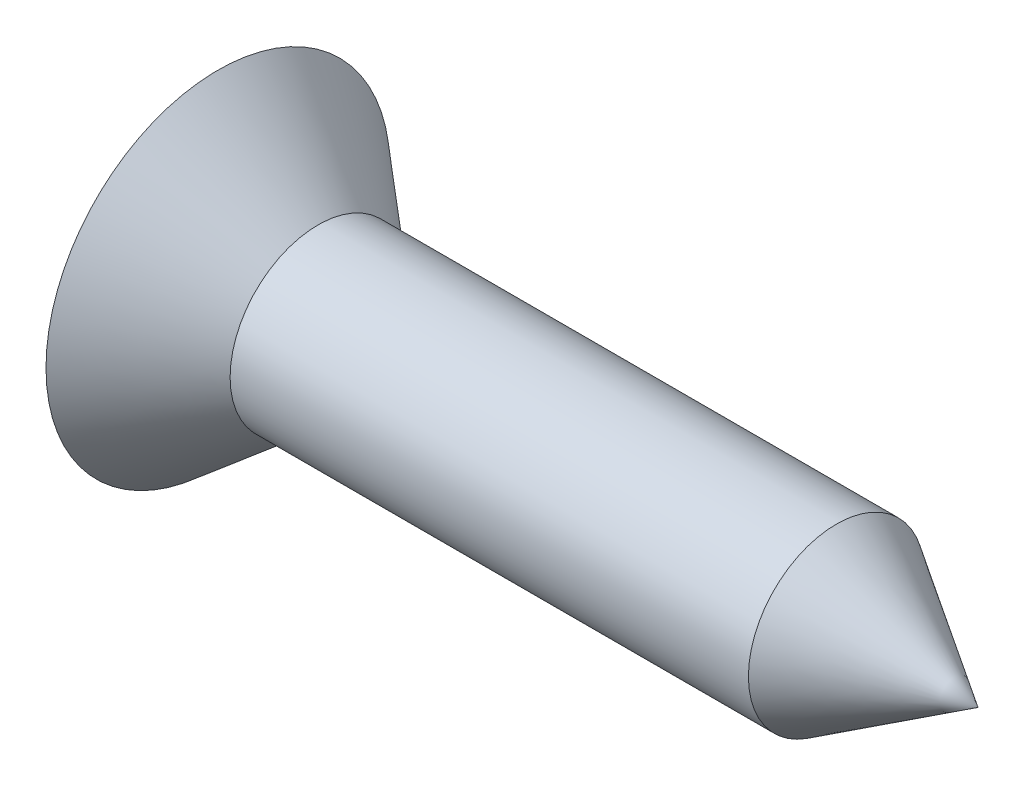
ISO-10303-21;
HEADER;
FILE_DESCRIPTION(('STEP AP214'),'2;1');
FILE_NAME('part.step','',(''),(''),'','','');
FILE_SCHEMA(('AUTOMOTIVE_DESIGN { 1 0 10303 214 1 1 1 1 }'));
ENDSEC;
DATA;
#1=APPLICATION_CONTEXT('core data for automotive mechanical design processes');
#2=APPLICATION_PROTOCOL_DEFINITION('international standard','automotive_design',2000,#1);
#3=PRODUCT_CONTEXT('',#1,'mechanical');
#4=PRODUCT('Part','Part','',(#3));
#5=PRODUCT_RELATED_PRODUCT_CATEGORY('part','',(#4));
#6=PRODUCT_DEFINITION_FORMATION('','',#4);
#7=PRODUCT_DEFINITION_CONTEXT('part definition',#1,'design');
#8=PRODUCT_DEFINITION('design','',#6,#7);
#9=PRODUCT_DEFINITION_SHAPE('','',#8);
#10=(LENGTH_UNIT() NAMED_UNIT(*) SI_UNIT(.MILLI.,.METRE.));
#11=(NAMED_UNIT(*) PLANE_ANGLE_UNIT() SI_UNIT($,.RADIAN.));
#12=(NAMED_UNIT(*) SI_UNIT($,.STERADIAN.) SOLID_ANGLE_UNIT());
#13=UNCERTAINTY_MEASURE_WITH_UNIT(LENGTH_MEASURE(1.E-05),#10,'distance_accuracy_value','');
#14=(GEOMETRIC_REPRESENTATION_CONTEXT(3) GLOBAL_UNCERTAINTY_ASSIGNED_CONTEXT((#13)) GLOBAL_UNIT_ASSIGNED_CONTEXT((#10,
#11,#12)) REPRESENTATION_CONTEXT('',''));
#15=CARTESIAN_POINT('',(0.,0.,0.));
#16=DIRECTION('',(0.,0.,1.));
#17=DIRECTION('',(1.,0.,0.));
#18=AXIS2_PLACEMENT_3D('',#15,#16,#17);
#19=CARTESIAN_POINT('',(0.,0.,0.));
#20=DIRECTION('',(1.,0.,0.));
#21=DIRECTION('',(0.,0.,-1.));
#22=AXIS2_PLACEMENT_3D('',#19,#20,#21);
#23=PLANE('',#22);
#24=CARTESIAN_POINT('',(0.,0.,0.));
#25=DIRECTION('',(-1.,0.,0.));
#26=DIRECTION('',(0.,0.,1.));
#27=AXIS2_PLACEMENT_3D('',#24,#25,#26);
#28=CIRCLE('',#27,2.15);
#29=CARTESIAN_POINT('',(0.,0.,2.15));
#30=VERTEX_POINT('',#29);
#31=EDGE_CURVE('E11',#30,#30,#28,.T.);
#32=ORIENTED_EDGE('',*,*,#31,.T.);
#33=EDGE_LOOP('',(#32));
#34=FACE_BOUND('',#33,.T.);
#35=ADVANCED_FACE('F45',(#34),#23,.F.);
#36=CARTESIAN_POINT('',(1.25134127222392,0.,0.));
#37=DIRECTION('',(-1.,0.,0.));
#38=DIRECTION('',(0.,0.,1.));
#39=AXIS2_PLACEMENT_3D('',#36,#37,#38);
#40=CONICAL_SURFACE('',#39,1.1,0.698131700797733);
#41=ORIENTED_EDGE('',*,*,#31,.F.);
#42=EDGE_LOOP('',(#41));
#43=FACE_BOUND('',#42,.T.);
#44=CARTESIAN_POINT('',(1.25134127222392,0.,0.));
#45=DIRECTION('',(-1.,0.,0.));
#46=DIRECTION('',(0.,0.,1.));
#47=AXIS2_PLACEMENT_3D('',#44,#45,#46);
#48=CIRCLE('',#47,1.1);
#49=CARTESIAN_POINT('',(1.25134127222392,0.,1.1));
#50=VERTEX_POINT('',#49);
#51=EDGE_CURVE('E52',#50,#50,#48,.T.);
#52=ORIENTED_EDGE('',*,*,#51,.T.);
#53=EDGE_LOOP('',(#52));
#54=FACE_BOUND('',#53,.T.);
#55=ADVANCED_FACE('F63',(#43,#54),#40,.T.);
#56=CARTESIAN_POINT('',(0.,0.,0.));
#57=DIRECTION('',(-1.,0.,0.));
#58=DIRECTION('',(0.,0.,1.));
#59=AXIS2_PLACEMENT_3D('',#56,#57,#58);
#60=CYLINDRICAL_SURFACE('',#59,1.1);
#61=ORIENTED_EDGE('',*,*,#51,.F.);
#62=EDGE_LOOP('',(#61));
#63=FACE_BOUND('',#62,.T.);
#64=CARTESIAN_POINT('',(7.73003528707654,0.,0.));
#65=DIRECTION('',(-1.,0.,0.));
#66=DIRECTION('',(0.,0.,1.));
#67=AXIS2_PLACEMENT_3D('',#64,#65,#66);
#68=CIRCLE('',#67,1.1);
#69=CARTESIAN_POINT('',(7.73003528707654,0.,1.1));
#70=VERTEX_POINT('',#69);
#71=EDGE_CURVE('E78',#70,#70,#68,.T.);
#72=ORIENTED_EDGE('',*,*,#71,.T.);
#73=EDGE_LOOP('',(#72));
#74=FACE_BOUND('',#73,.T.);
#75=ADVANCED_FACE('F57',(#63,#74),#60,.T.);
#76=CARTESIAN_POINT('',(9.5,0.,0.));
#77=DIRECTION('',(-1.,0.,0.));
#78=DIRECTION('',(0.,0.,1.));
#79=AXIS2_PLACEMENT_3D('',#76,#77,#78);
#80=CONICAL_SURFACE('',#79,0.,0.556065023717264);
#81=ORIENTED_EDGE('',*,*,#71,.F.);
#82=EDGE_LOOP('',(#81));
#83=FACE_BOUND('',#82,.T.);
#84=CARTESIAN_POINT('',(9.5,0.,0.));
#85=VERTEX_POINT('',#84);
#86=VERTEX_LOOP('',#85);
#87=FACE_BOUND('',#86,.T.);
#88=ADVANCED_FACE('F55',(#83,#87),#80,.T.);
#89=CLOSED_SHELL('',(#35,#55,#75,#88));
#90=MANIFOLD_SOLID_BREP('B2',#89);
#91=ADVANCED_BREP_SHAPE_REPRESENTATION('',(#18,#90),#14);
#92=SHAPE_DEFINITION_REPRESENTATION(#9,#91);
ENDSEC;
END-ISO-10303-21;
